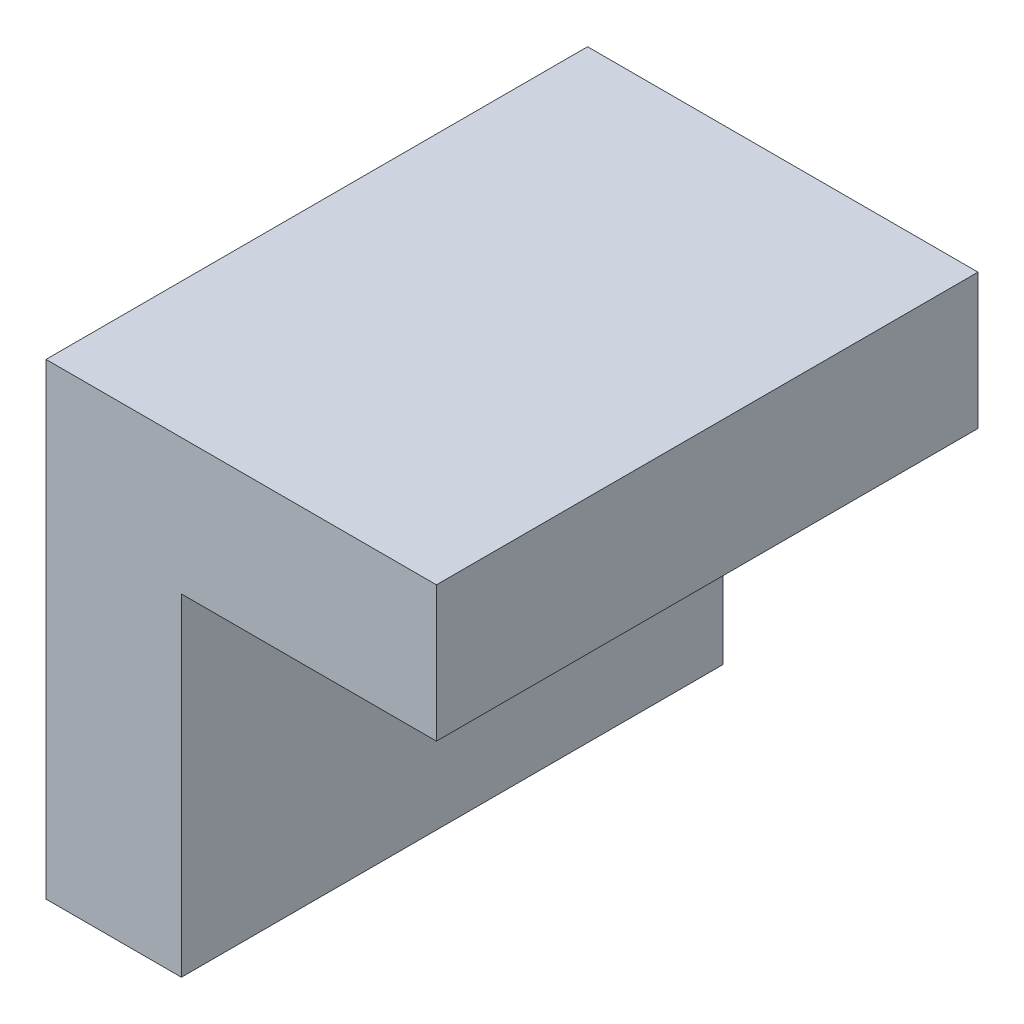
ISO-10303-21;
HEADER;
FILE_DESCRIPTION(('STEP AP214'),'2;1');
FILE_NAME('part.step','',(''),(''),'','','');
FILE_SCHEMA(('AUTOMOTIVE_DESIGN { 1 0 10303 214 1 1 1 1 }'));
ENDSEC;
DATA;
#1=APPLICATION_CONTEXT('core data for automotive mechanical design processes');
#2=APPLICATION_PROTOCOL_DEFINITION('international standard','automotive_design',2000,#1);
#3=PRODUCT_CONTEXT('',#1,'mechanical');
#4=PRODUCT('Part','Part','',(#3));
#5=PRODUCT_RELATED_PRODUCT_CATEGORY('part','',(#4));
#6=PRODUCT_DEFINITION_FORMATION('','',#4);
#7=PRODUCT_DEFINITION_CONTEXT('part definition',#1,'design');
#8=PRODUCT_DEFINITION('design','',#6,#7);
#9=PRODUCT_DEFINITION_SHAPE('','',#8);
#10=(LENGTH_UNIT() NAMED_UNIT(*) SI_UNIT(.MILLI.,.METRE.));
#11=(NAMED_UNIT(*) PLANE_ANGLE_UNIT() SI_UNIT($,.RADIAN.));
#12=(NAMED_UNIT(*) SI_UNIT($,.STERADIAN.) SOLID_ANGLE_UNIT());
#13=UNCERTAINTY_MEASURE_WITH_UNIT(LENGTH_MEASURE(1.E-05),#10,'distance_accuracy_value','');
#14=(GEOMETRIC_REPRESENTATION_CONTEXT(3) GLOBAL_UNCERTAINTY_ASSIGNED_CONTEXT((#13)) GLOBAL_UNIT_ASSIGNED_CONTEXT((#10,
#11,#12)) REPRESENTATION_CONTEXT('',''));
#15=CARTESIAN_POINT('',(0.,0.,0.));
#16=DIRECTION('',(0.,0.,1.));
#17=DIRECTION('',(1.,0.,0.));
#18=AXIS2_PLACEMENT_3D('',#15,#16,#17);
#19=CARTESIAN_POINT('',(0.,49.0449067652951,80.));
#20=DIRECTION('',(0.,1.,0.));
#21=DIRECTION('',(0.,0.,1.));
#22=AXIS2_PLACEMENT_3D('',#19,#20,#21);
#23=PLANE('',#22);
#24=DIRECTION('',(1.,0.,0.));
#25=VECTOR('',#24,1.);
#26=CARTESIAN_POINT('',(0.,49.0449067652951,0.));
#27=LINE('',#26,#25);
#28=CARTESIAN_POINT('',(10.,49.0449067652951,0.));
#29=VERTEX_POINT('',#28);
#30=CARTESIAN_POINT('',(47.6747726922484,49.0449067652951,0.));
#31=VERTEX_POINT('',#30);
#32=EDGE_CURVE('E125',#29,#31,#27,.T.);
#33=ORIENTED_EDGE('',*,*,#32,.T.);
#34=DIRECTION('',(0.,0.,-1.));
#35=VECTOR('',#34,1.);
#36=CARTESIAN_POINT('',(47.6747726922484,49.0449067652951,80.));
#37=LINE('',#36,#35);
#38=CARTESIAN_POINT('',(47.6747726922484,49.0449067652951,80.));
#39=VERTEX_POINT('',#38);
#40=EDGE_CURVE('E11',#39,#31,#37,.T.);
#41=ORIENTED_EDGE('',*,*,#40,.F.);
#42=DIRECTION('',(1.,0.,0.));
#43=VECTOR('',#42,1.);
#44=CARTESIAN_POINT('',(0.,49.0449067652951,80.));
#45=LINE('',#44,#43);
#46=CARTESIAN_POINT('',(10.,49.0449067652951,80.));
#47=VERTEX_POINT('',#46);
#48=EDGE_CURVE('E86',#47,#39,#45,.T.);
#49=ORIENTED_EDGE('',*,*,#48,.F.);
#50=DIRECTION('',(0.,0.,-1.));
#51=VECTOR('',#50,1.);
#52=CARTESIAN_POINT('',(10.,49.0449067652951,80.));
#53=LINE('',#52,#51);
#54=EDGE_CURVE('E121',#47,#29,#53,.T.);
#55=ORIENTED_EDGE('',*,*,#54,.T.);
#56=EDGE_LOOP('',(#33,#41,#49,#55));
#57=FACE_BOUND('',#56,.T.);
#58=ADVANCED_FACE('F39',(#57),#23,.F.);
#59=CARTESIAN_POINT('',(47.6747726922484,69.0449067652951,80.));
#60=DIRECTION('',(1.,0.,0.));
#61=DIRECTION('',(0.,0.,-1.));
#62=AXIS2_PLACEMENT_3D('',#59,#60,#61);
#63=PLANE('',#62);
#64=DIRECTION('',(0.,-1.,0.));
#65=VECTOR('',#64,1.);
#66=CARTESIAN_POINT('',(47.6747726922484,69.0449067652951,0.));
#67=LINE('',#66,#65);
#68=CARTESIAN_POINT('',(47.6747726922484,69.0449067652951,0.));
#69=VERTEX_POINT('',#68);
#70=EDGE_CURVE('E129',#69,#31,#67,.T.);
#71=ORIENTED_EDGE('',*,*,#70,.F.);
#72=DIRECTION('',(0.,0.,-1.));
#73=VECTOR('',#72,1.);
#74=CARTESIAN_POINT('',(47.6747726922484,69.0449067652951,80.));
#75=LINE('',#74,#73);
#76=CARTESIAN_POINT('',(47.6747726922484,69.0449067652951,80.));
#77=VERTEX_POINT('',#76);
#78=EDGE_CURVE('E48',#77,#69,#75,.T.);
#79=ORIENTED_EDGE('',*,*,#78,.F.);
#80=DIRECTION('',(0.,-1.,0.));
#81=VECTOR('',#80,1.);
#82=CARTESIAN_POINT('',(47.6747726922484,69.0449067652951,80.));
#83=LINE('',#82,#81);
#84=EDGE_CURVE('E225',#77,#39,#83,.T.);
#85=ORIENTED_EDGE('',*,*,#84,.T.);
#86=ORIENTED_EDGE('',*,*,#40,.T.);
#87=EDGE_LOOP('',(#71,#79,#85,#86));
#88=FACE_BOUND('',#87,.T.);
#89=ADVANCED_FACE('F156',(#88),#63,.T.);
#90=CARTESIAN_POINT('',(0.,69.0449067652951,80.));
#91=DIRECTION('',(0.,1.,0.));
#92=DIRECTION('',(0.,0.,1.));
#93=AXIS2_PLACEMENT_3D('',#90,#91,#92);
#94=PLANE('',#93);
#95=DIRECTION('',(1.,0.,0.));
#96=VECTOR('',#95,1.);
#97=CARTESIAN_POINT('',(0.,69.0449067652951,0.));
#98=LINE('',#97,#96);
#99=CARTESIAN_POINT('',(-10.,69.0449067652951,0.));
#100=VERTEX_POINT('',#99);
#101=EDGE_CURVE('E133',#100,#69,#98,.T.);
#102=ORIENTED_EDGE('',*,*,#101,.F.);
#103=DIRECTION('',(0.,0.,-1.));
#104=VECTOR('',#103,1.);
#105=CARTESIAN_POINT('',(-10.,69.0449067652951,80.));
#106=LINE('',#105,#104);
#107=CARTESIAN_POINT('',(-10.,69.0449067652951,80.));
#108=VERTEX_POINT('',#107);
#109=EDGE_CURVE('E108',#108,#100,#106,.T.);
#110=ORIENTED_EDGE('',*,*,#109,.F.);
#111=DIRECTION('',(1.,0.,0.));
#112=VECTOR('',#111,1.);
#113=CARTESIAN_POINT('',(0.,69.0449067652951,80.));
#114=LINE('',#113,#112);
#115=EDGE_CURVE('E114',#108,#77,#114,.T.);
#116=ORIENTED_EDGE('',*,*,#115,.T.);
#117=ORIENTED_EDGE('',*,*,#78,.T.);
#118=EDGE_LOOP('',(#102,#110,#116,#117));
#119=FACE_BOUND('',#118,.T.);
#120=ADVANCED_FACE('F153',(#119),#94,.T.);
#121=CARTESIAN_POINT('',(-10.,0.,80.));
#122=DIRECTION('',(-1.,0.,0.));
#123=DIRECTION('',(0.,0.,1.));
#124=AXIS2_PLACEMENT_3D('',#121,#122,#123);
#125=PLANE('',#124);
#126=DIRECTION('',(0.,1.,0.));
#127=VECTOR('',#126,1.);
#128=CARTESIAN_POINT('',(-10.,0.,0.));
#129=LINE('',#128,#127);
#130=CARTESIAN_POINT('',(-10.,0.,0.));
#131=VERTEX_POINT('',#130);
#132=EDGE_CURVE('E102',#131,#100,#129,.T.);
#133=ORIENTED_EDGE('',*,*,#132,.F.);
#134=DIRECTION('',(0.,0.,-1.));
#135=VECTOR('',#134,1.);
#136=CARTESIAN_POINT('',(-10.,0.,80.));
#137=LINE('',#136,#135);
#138=CARTESIAN_POINT('',(-10.,0.,80.));
#139=VERTEX_POINT('',#138);
#140=EDGE_CURVE('E97',#139,#131,#137,.T.);
#141=ORIENTED_EDGE('',*,*,#140,.F.);
#142=DIRECTION('',(0.,1.,0.));
#143=VECTOR('',#142,1.);
#144=CARTESIAN_POINT('',(-10.,0.,80.));
#145=LINE('',#144,#143);
#146=EDGE_CURVE('E100',#139,#108,#145,.T.);
#147=ORIENTED_EDGE('',*,*,#146,.T.);
#148=ORIENTED_EDGE('',*,*,#109,.T.);
#149=EDGE_LOOP('',(#133,#141,#147,#148));
#150=FACE_BOUND('',#149,.T.);
#151=ADVANCED_FACE('F99',(#150),#125,.T.);
#152=CARTESIAN_POINT('',(10.,0.,80.));
#153=DIRECTION('',(0.,-1.,0.));
#154=DIRECTION('',(0.,0.,-1.));
#155=AXIS2_PLACEMENT_3D('',#152,#153,#154);
#156=PLANE('',#155);
#157=DIRECTION('',(-1.,0.,0.));
#158=VECTOR('',#157,1.);
#159=CARTESIAN_POINT('',(10.,0.,0.));
#160=LINE('',#159,#158);
#161=CARTESIAN_POINT('',(10.,0.,0.));
#162=VERTEX_POINT('',#161);
#163=EDGE_CURVE('E139',#162,#131,#160,.T.);
#164=ORIENTED_EDGE('',*,*,#163,.F.);
#165=DIRECTION('',(0.,0.,-1.));
#166=VECTOR('',#165,1.);
#167=CARTESIAN_POINT('',(10.,0.,80.));
#168=LINE('',#167,#166);
#169=CARTESIAN_POINT('',(10.,0.,80.));
#170=VERTEX_POINT('',#169);
#171=EDGE_CURVE('E77',#170,#162,#168,.T.);
#172=ORIENTED_EDGE('',*,*,#171,.F.);
#173=DIRECTION('',(-1.,0.,0.));
#174=VECTOR('',#173,1.);
#175=CARTESIAN_POINT('',(10.,0.,80.));
#176=LINE('',#175,#174);
#177=EDGE_CURVE('E112',#170,#139,#176,.T.);
#178=ORIENTED_EDGE('',*,*,#177,.T.);
#179=ORIENTED_EDGE('',*,*,#140,.T.);
#180=EDGE_LOOP('',(#164,#172,#178,#179));
#181=FACE_BOUND('',#180,.T.);
#182=ADVANCED_FACE('F117',(#181),#156,.T.);
#183=CARTESIAN_POINT('',(10.,0.,80.));
#184=DIRECTION('',(-1.,0.,0.));
#185=DIRECTION('',(0.,0.,1.));
#186=AXIS2_PLACEMENT_3D('',#183,#184,#185);
#187=PLANE('',#186);
#188=DIRECTION('',(0.,1.,0.));
#189=VECTOR('',#188,1.);
#190=CARTESIAN_POINT('',(10.,0.,0.));
#191=LINE('',#190,#189);
#192=EDGE_CURVE('E80',#162,#29,#191,.T.);
#193=ORIENTED_EDGE('',*,*,#192,.T.);
#194=ORIENTED_EDGE('',*,*,#54,.F.);
#195=DIRECTION('',(0.,1.,0.));
#196=VECTOR('',#195,1.);
#197=CARTESIAN_POINT('',(10.,0.,80.));
#198=LINE('',#197,#196);
#199=EDGE_CURVE('E56',#170,#47,#198,.T.);
#200=ORIENTED_EDGE('',*,*,#199,.F.);
#201=ORIENTED_EDGE('',*,*,#171,.T.);
#202=EDGE_LOOP('',(#193,#194,#200,#201));
#203=FACE_BOUND('',#202,.T.);
#204=ADVANCED_FACE('F161',(#203),#187,.F.);
#205=CARTESIAN_POINT('',(0.,0.,80.));
#206=DIRECTION('',(0.,0.,-1.));
#207=DIRECTION('',(-1.,0.,0.));
#208=AXIS2_PLACEMENT_3D('',#205,#206,#207);
#209=PLANE('',#208);
#210=ORIENTED_EDGE('',*,*,#48,.T.);
#211=ORIENTED_EDGE('',*,*,#84,.F.);
#212=ORIENTED_EDGE('',*,*,#115,.F.);
#213=ORIENTED_EDGE('',*,*,#146,.F.);
#214=ORIENTED_EDGE('',*,*,#177,.F.);
#215=ORIENTED_EDGE('',*,*,#199,.T.);
#216=EDGE_LOOP('',(#210,#211,#212,#213,#214,#215));
#217=FACE_BOUND('',#216,.T.);
#218=ADVANCED_FACE('F111',(#217),#209,.F.);
#219=CARTESIAN_POINT('',(0.,0.,0.));
#220=DIRECTION('',(0.,0.,-1.));
#221=DIRECTION('',(-1.,0.,0.));
#222=AXIS2_PLACEMENT_3D('',#219,#220,#221);
#223=PLANE('',#222);
#224=ORIENTED_EDGE('',*,*,#32,.F.);
#225=ORIENTED_EDGE('',*,*,#192,.F.);
#226=ORIENTED_EDGE('',*,*,#163,.T.);
#227=ORIENTED_EDGE('',*,*,#132,.T.);
#228=ORIENTED_EDGE('',*,*,#101,.T.);
#229=ORIENTED_EDGE('',*,*,#70,.T.);
#230=EDGE_LOOP('',(#224,#225,#226,#227,#228,#229));
#231=FACE_BOUND('',#230,.T.);
#232=ADVANCED_FACE('F159',(#231),#223,.T.);
#233=CLOSED_SHELL('',(#58,#89,#120,#151,#182,#204,#218,#232));
#234=MANIFOLD_SOLID_BREP('B2',#233);
#235=ADVANCED_BREP_SHAPE_REPRESENTATION('',(#18,#234),#14);
#236=SHAPE_DEFINITION_REPRESENTATION(#9,#235);
ENDSEC;
END-ISO-10303-21;
